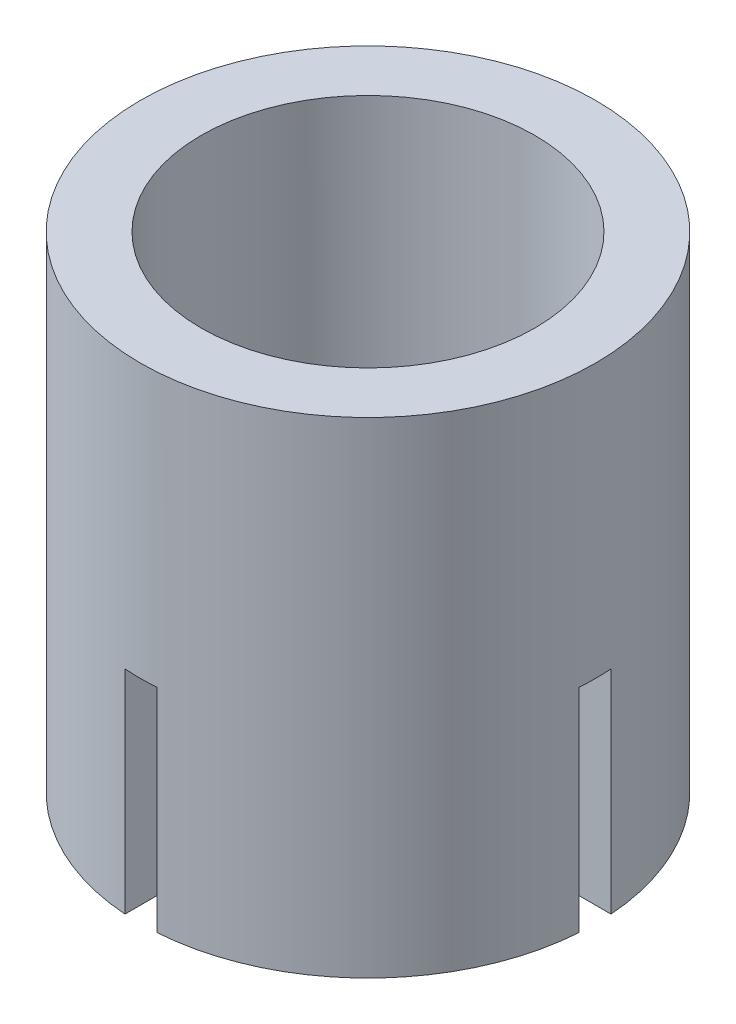
ISO-10303-21;
HEADER;
FILE_DESCRIPTION(('STEP AP214'),'2;1');
FILE_NAME('part.step','',(''),(''),'','','');
FILE_SCHEMA(('AUTOMOTIVE_DESIGN { 1 0 10303 214 1 1 1 1 }'));
ENDSEC;
DATA;
#1=APPLICATION_CONTEXT('core data for automotive mechanical design processes');
#2=APPLICATION_PROTOCOL_DEFINITION('international standard','automotive_design',2000,#1);
#3=PRODUCT_CONTEXT('',#1,'mechanical');
#4=PRODUCT('Part','Part','',(#3));
#5=PRODUCT_RELATED_PRODUCT_CATEGORY('part','',(#4));
#6=PRODUCT_DEFINITION_FORMATION('','',#4);
#7=PRODUCT_DEFINITION_CONTEXT('part definition',#1,'design');
#8=PRODUCT_DEFINITION('design','',#6,#7);
#9=PRODUCT_DEFINITION_SHAPE('','',#8);
#10=(LENGTH_UNIT() NAMED_UNIT(*) SI_UNIT(.MILLI.,.METRE.));
#11=(NAMED_UNIT(*) PLANE_ANGLE_UNIT() SI_UNIT($,.RADIAN.));
#12=(NAMED_UNIT(*) SI_UNIT($,.STERADIAN.) SOLID_ANGLE_UNIT());
#13=UNCERTAINTY_MEASURE_WITH_UNIT(LENGTH_MEASURE(1.E-05),#10,'distance_accuracy_value','');
#14=(GEOMETRIC_REPRESENTATION_CONTEXT(3) GLOBAL_UNCERTAINTY_ASSIGNED_CONTEXT((#13)) GLOBAL_UNIT_ASSIGNED_CONTEXT((#10,
#11,#12)) REPRESENTATION_CONTEXT('',''));
#15=CARTESIAN_POINT('',(0.,0.,0.));
#16=DIRECTION('',(0.,0.,1.));
#17=DIRECTION('',(1.,0.,0.));
#18=AXIS2_PLACEMENT_3D('',#15,#16,#17);
#19=CARTESIAN_POINT('',(0.,6.,0.));
#20=DIRECTION('',(0.,1.,0.));
#21=DIRECTION('',(0.,0.,1.));
#22=AXIS2_PLACEMENT_3D('',#19,#20,#21);
#23=PLANE('',#22);
#24=CARTESIAN_POINT('',(0.,6.,0.));
#25=DIRECTION('',(0.,1.,0.));
#26=DIRECTION('',(0.,0.,1.));
#27=AXIS2_PLACEMENT_3D('',#24,#25,#26);
#28=CIRCLE('',#27,3.);
#29=CARTESIAN_POINT('',(0.527362107006941,6.,2.9532844780165));
#30=VERTEX_POINT('',#29);
#31=CARTESIAN_POINT('',(2.9532844780165,6.,0.527362107006941));
#32=VERTEX_POINT('',#31);
#33=EDGE_CURVE('E252',#30,#32,#28,.T.);
#34=ORIENTED_EDGE('',*,*,#33,.F.);
#35=DIRECTION('',(0.,0.,1.));
#36=VECTOR('',#35,1.);
#37=CARTESIAN_POINT('',(0.527362107006941,6.,0.));
#38=LINE('',#37,#36);
#39=CARTESIAN_POINT('',(0.527362107006941,6.,5.47465882115892));
#40=VERTEX_POINT('',#39);
#41=EDGE_CURVE('E344',#30,#40,#38,.T.);
#42=ORIENTED_EDGE('',*,*,#41,.T.);
#43=CARTESIAN_POINT('',(0.,6.,0.));
#44=DIRECTION('',(0.,1.,0.));
#45=DIRECTION('',(0.,0.,1.));
#46=AXIS2_PLACEMENT_3D('',#43,#44,#45);
#47=CIRCLE('',#46,5.5);
#48=CARTESIAN_POINT('',(5.47465882115892,6.,0.527362107006941));
#49=VERTEX_POINT('',#48);
#50=EDGE_CURVE('E355',#40,#49,#47,.T.);
#51=ORIENTED_EDGE('',*,*,#50,.T.);
#52=DIRECTION('',(-1.,0.,0.));
#53=VECTOR('',#52,1.);
#54=CARTESIAN_POINT('',(0.,6.,0.527362107006941));
#55=LINE('',#54,#53);
#56=EDGE_CURVE('E332',#49,#32,#55,.T.);
#57=ORIENTED_EDGE('',*,*,#56,.T.);
#58=EDGE_LOOP('',(#34,#42,#51,#57));
#59=FACE_BOUND('',#58,.T.);
#60=ADVANCED_FACE('F39',(#59),#23,.T.);
#61=DIRECTION('',(0.,0.,1.));
#62=VECTOR('',#61,1.);
#63=CARTESIAN_POINT('',(-0.527362107006938,6.,0.));
#64=LINE('',#63,#62);
#65=CARTESIAN_POINT('',(-0.527362107006938,6.,2.9532844780165));
#66=VERTEX_POINT('',#65);
#67=CARTESIAN_POINT('',(-0.527362107006938,6.,5.47465882115892));
#68=VERTEX_POINT('',#67);
#69=EDGE_CURVE('E339',#66,#68,#64,.T.);
#70=ORIENTED_EDGE('',*,*,#69,.F.);
#71=CARTESIAN_POINT('',(-2.9532844780165,6.,0.527362107006941));
#72=VERTEX_POINT('',#71);
#73=EDGE_CURVE('E222',#72,#66,#28,.T.);
#74=ORIENTED_EDGE('',*,*,#73,.F.);
#75=DIRECTION('',(-1.,0.,0.));
#76=VECTOR('',#75,1.);
#77=CARTESIAN_POINT('',(0.,6.,0.527362107006941));
#78=LINE('',#77,#76);
#79=CARTESIAN_POINT('',(-5.47465882115892,6.,0.527362107006941));
#80=VERTEX_POINT('',#79);
#81=EDGE_CURVE('E316',#72,#80,#78,.T.);
#82=ORIENTED_EDGE('',*,*,#81,.T.);
#83=EDGE_CURVE('E351',#80,#68,#47,.T.);
#84=ORIENTED_EDGE('',*,*,#83,.T.);
#85=EDGE_LOOP('',(#70,#74,#82,#84));
#86=FACE_BOUND('',#85,.T.);
#87=ADVANCED_FACE('F534',(#86),#23,.T.);
#88=DIRECTION('',(-1.,0.,0.));
#89=VECTOR('',#88,1.);
#90=CARTESIAN_POINT('',(0.,6.,-0.527362107006941));
#91=LINE('',#90,#89);
#92=CARTESIAN_POINT('',(5.47465882115892,6.,-0.527362107006941));
#93=VERTEX_POINT('',#92);
#94=CARTESIAN_POINT('',(2.9532844780165,6.,-0.527362107006941));
#95=VERTEX_POINT('',#94);
#96=EDGE_CURVE('E329',#93,#95,#91,.T.);
#97=ORIENTED_EDGE('',*,*,#96,.F.);
#98=CARTESIAN_POINT('',(0.527362107006941,6.,-5.47465882115892));
#99=VERTEX_POINT('',#98);
#100=EDGE_CURVE('E358',#93,#99,#47,.T.);
#101=ORIENTED_EDGE('',*,*,#100,.T.);
#102=DIRECTION('',(0.,0.,1.));
#103=VECTOR('',#102,1.);
#104=CARTESIAN_POINT('',(0.527362107006941,6.,0.));
#105=LINE('',#104,#103);
#106=CARTESIAN_POINT('',(0.527362107006941,6.,-2.9532844780165));
#107=VERTEX_POINT('',#106);
#108=EDGE_CURVE('E326',#99,#107,#105,.T.);
#109=ORIENTED_EDGE('',*,*,#108,.T.);
#110=EDGE_CURVE('E271',#95,#107,#28,.T.);
#111=ORIENTED_EDGE('',*,*,#110,.F.);
#112=EDGE_LOOP('',(#97,#101,#109,#111));
#113=FACE_BOUND('',#112,.T.);
#114=ADVANCED_FACE('F529',(#113),#23,.T.);
#115=DIRECTION('',(0.,0.,1.));
#116=VECTOR('',#115,1.);
#117=CARTESIAN_POINT('',(-0.527362107006938,6.,0.));
#118=LINE('',#117,#116);
#119=CARTESIAN_POINT('',(-0.527362107006938,6.,-5.47465882115892));
#120=VERTEX_POINT('',#119);
#121=CARTESIAN_POINT('',(-0.527362107006938,6.,-2.9532844780165));
#122=VERTEX_POINT('',#121);
#123=EDGE_CURVE('E323',#120,#122,#118,.T.);
#124=ORIENTED_EDGE('',*,*,#123,.F.);
#125=CARTESIAN_POINT('',(-5.47465882115892,6.,-0.527362107006941));
#126=VERTEX_POINT('',#125);
#127=EDGE_CURVE('E383',#120,#126,#47,.T.);
#128=ORIENTED_EDGE('',*,*,#127,.T.);
#129=DIRECTION('',(-1.,0.,0.));
#130=VECTOR('',#129,1.);
#131=CARTESIAN_POINT('',(0.,6.,-0.527362107006941));
#132=LINE('',#131,#130);
#133=CARTESIAN_POINT('',(-2.9532844780165,6.,-0.527362107006941));
#134=VERTEX_POINT('',#133);
#135=EDGE_CURVE('E309',#134,#126,#132,.T.);
#136=ORIENTED_EDGE('',*,*,#135,.F.);
#137=EDGE_CURVE('E251',#122,#134,#28,.T.);
#138=ORIENTED_EDGE('',*,*,#137,.F.);
#139=EDGE_LOOP('',(#124,#128,#136,#138));
#140=FACE_BOUND('',#139,.T.);
#141=ADVANCED_FACE('F380',(#140),#23,.T.);
#142=CARTESIAN_POINT('',(0.,0.,0.));
#143=DIRECTION('',(0.,1.,0.));
#144=DIRECTION('',(0.,0.,1.));
#145=AXIS2_PLACEMENT_3D('',#142,#143,#144);
#146=PLANE('',#145);
#147=DIRECTION('',(0.,0.,-1.));
#148=VECTOR('',#147,1.);
#149=CARTESIAN_POINT('',(0.527362107006941,0.,0.));
#150=LINE('',#149,#148);
#151=CARTESIAN_POINT('',(0.527362107006941,0.,7.48143630649177));
#152=VERTEX_POINT('',#151);
#153=CARTESIAN_POINT('',(0.527362107006941,0.,2.9532844780165));
#154=VERTEX_POINT('',#153);
#155=EDGE_CURVE('E213',#152,#154,#150,.T.);
#156=ORIENTED_EDGE('',*,*,#155,.T.);
#157=CARTESIAN_POINT('',(0.,0.,0.));
#158=DIRECTION('',(0.,1.,0.));
#159=DIRECTION('',(0.,0.,1.));
#160=AXIS2_PLACEMENT_3D('',#157,#158,#159);
#161=CIRCLE('',#160,3.);
#162=CARTESIAN_POINT('',(2.9532844780165,0.,0.527362107006941));
#163=VERTEX_POINT('',#162);
#164=EDGE_CURVE('E233',#154,#163,#161,.T.);
#165=ORIENTED_EDGE('',*,*,#164,.T.);
#166=DIRECTION('',(1.,0.,0.));
#167=VECTOR('',#166,1.);
#168=CARTESIAN_POINT('',(0.,0.,0.527362107006941));
#169=LINE('',#168,#167);
#170=CARTESIAN_POINT('',(7.48143630649177,0.,0.527362107006941));
#171=VERTEX_POINT('',#170);
#172=EDGE_CURVE('E455',#163,#171,#169,.T.);
#173=ORIENTED_EDGE('',*,*,#172,.T.);
#174=CARTESIAN_POINT('',(0.,0.,0.));
#175=DIRECTION('',(0.,1.,0.));
#176=DIRECTION('',(0.,0.,1.));
#177=AXIS2_PLACEMENT_3D('',#174,#175,#176);
#178=CIRCLE('',#177,7.5);
#179=EDGE_CURVE('E369',#152,#171,#178,.T.);
#180=ORIENTED_EDGE('',*,*,#179,.F.);
#181=EDGE_LOOP('',(#156,#165,#173,#180));
#182=FACE_BOUND('',#181,.T.);
#183=ADVANCED_FACE('F509',(#182),#146,.F.);
#184=CARTESIAN_POINT('',(-2.9532844780165,0.,0.527362107006941));
#185=VERTEX_POINT('',#184);
#186=CARTESIAN_POINT('',(-0.527362107006938,0.,2.9532844780165));
#187=VERTEX_POINT('',#186);
#188=EDGE_CURVE('E220',#185,#187,#161,.T.);
#189=ORIENTED_EDGE('',*,*,#188,.T.);
#190=DIRECTION('',(0.,0.,-1.));
#191=VECTOR('',#190,1.);
#192=CARTESIAN_POINT('',(-0.527362107006938,0.,0.));
#193=LINE('',#192,#191);
#194=CARTESIAN_POINT('',(-0.527362107006938,0.,7.48143630649177));
#195=VERTEX_POINT('',#194);
#196=EDGE_CURVE('E200',#195,#187,#193,.T.);
#197=ORIENTED_EDGE('',*,*,#196,.F.);
#198=CARTESIAN_POINT('',(-7.48143630649177,0.,0.527362107006941));
#199=VERTEX_POINT('',#198);
#200=EDGE_CURVE('E361',#199,#195,#178,.T.);
#201=ORIENTED_EDGE('',*,*,#200,.F.);
#202=DIRECTION('',(1.,0.,0.));
#203=VECTOR('',#202,1.);
#204=CARTESIAN_POINT('',(0.,0.,0.527362107006941));
#205=LINE('',#204,#203);
#206=EDGE_CURVE('E228',#199,#185,#205,.T.);
#207=ORIENTED_EDGE('',*,*,#206,.T.);
#208=EDGE_LOOP('',(#189,#197,#201,#207));
#209=FACE_BOUND('',#208,.T.);
#210=ADVANCED_FACE('F227',(#209),#146,.F.);
#211=CARTESIAN_POINT('',(7.48143630649177,0.,-0.527362107006941));
#212=VERTEX_POINT('',#211);
#213=CARTESIAN_POINT('',(0.527362107006941,0.,-7.48143630649177));
#214=VERTEX_POINT('',#213);
#215=EDGE_CURVE('E502',#212,#214,#178,.T.);
#216=ORIENTED_EDGE('',*,*,#215,.F.);
#217=DIRECTION('',(1.,0.,0.));
#218=VECTOR('',#217,1.);
#219=CARTESIAN_POINT('',(0.,0.,-0.527362107006941));
#220=LINE('',#219,#218);
#221=CARTESIAN_POINT('',(2.9532844780165,0.,-0.527362107006941));
#222=VERTEX_POINT('',#221);
#223=EDGE_CURVE('E262',#222,#212,#220,.T.);
#224=ORIENTED_EDGE('',*,*,#223,.F.);
#225=CARTESIAN_POINT('',(0.527362107006941,0.,-2.9532844780165));
#226=VERTEX_POINT('',#225);
#227=EDGE_CURVE('E237',#222,#226,#161,.T.);
#228=ORIENTED_EDGE('',*,*,#227,.T.);
#229=DIRECTION('',(0.,0.,-1.));
#230=VECTOR('',#229,1.);
#231=CARTESIAN_POINT('',(0.527362107006941,0.,0.));
#232=LINE('',#231,#230);
#233=EDGE_CURVE('E260',#226,#214,#232,.T.);
#234=ORIENTED_EDGE('',*,*,#233,.T.);
#235=EDGE_LOOP('',(#216,#224,#228,#234));
#236=FACE_BOUND('',#235,.T.);
#237=ADVANCED_FACE('F259',(#236),#146,.F.);
#238=CARTESIAN_POINT('',(-0.527362107006938,0.,-7.48143630649177));
#239=VERTEX_POINT('',#238);
#240=CARTESIAN_POINT('',(-7.48143630649177,0.,-0.527362107006941));
#241=VERTEX_POINT('',#240);
#242=EDGE_CURVE('E368',#239,#241,#178,.T.);
#243=ORIENTED_EDGE('',*,*,#242,.F.);
#244=DIRECTION('',(0.,0.,-1.));
#245=VECTOR('',#244,1.);
#246=CARTESIAN_POINT('',(-0.527362107006938,0.,0.));
#247=LINE('',#246,#245);
#248=CARTESIAN_POINT('',(-0.527362107006938,0.,-2.9532844780165));
#249=VERTEX_POINT('',#248);
#250=EDGE_CURVE('E479',#249,#239,#247,.T.);
#251=ORIENTED_EDGE('',*,*,#250,.F.);
#252=CARTESIAN_POINT('',(-2.9532844780165,0.,-0.527362107006941));
#253=VERTEX_POINT('',#252);
#254=EDGE_CURVE('E230',#249,#253,#161,.T.);
#255=ORIENTED_EDGE('',*,*,#254,.T.);
#256=DIRECTION('',(1.,0.,0.));
#257=VECTOR('',#256,1.);
#258=CARTESIAN_POINT('',(0.,0.,-0.527362107006941));
#259=LINE('',#258,#257);
#260=EDGE_CURVE('E295',#241,#253,#259,.T.);
#261=ORIENTED_EDGE('',*,*,#260,.F.);
#262=EDGE_LOOP('',(#243,#251,#255,#261));
#263=FACE_BOUND('',#262,.T.);
#264=ADVANCED_FACE('F500',(#263),#146,.F.);
#265=CARTESIAN_POINT('',(0.,6.,0.));
#266=DIRECTION('',(0.,-1.,0.));
#267=DIRECTION('',(0.,0.,-1.));
#268=AXIS2_PLACEMENT_3D('',#265,#266,#267);
#269=CYLINDRICAL_SURFACE('',#268,7.5);
#270=CARTESIAN_POINT('',(0.,16.,0.));
#271=DIRECTION('',(0.,1.,0.));
#272=DIRECTION('',(0.,0.,1.));
#273=AXIS2_PLACEMENT_3D('',#270,#271,#272);
#274=CIRCLE('',#273,7.5);
#275=CARTESIAN_POINT('',(0.,16.,7.5));
#276=VERTEX_POINT('',#275);
#277=EDGE_CURVE('E231',#276,#276,#274,.T.);
#278=ORIENTED_EDGE('',*,*,#277,.F.);
#279=EDGE_LOOP('',(#278));
#280=FACE_BOUND('',#279,.T.);
#281=DIRECTION('',(0.,-1.,0.));
#282=VECTOR('',#281,1.);
#283=CARTESIAN_POINT('',(0.527362107006941,6.,7.48143630649177));
#284=LINE('',#283,#282);
#285=CARTESIAN_POINT('',(0.527362107006941,7.,7.48143630649177));
#286=VERTEX_POINT('',#285);
#287=EDGE_CURVE('E348',#152,#286,#284,.F.);
#288=ORIENTED_EDGE('',*,*,#287,.F.);
#289=ORIENTED_EDGE('',*,*,#179,.T.);
#290=DIRECTION('',(0.,-1.,0.));
#291=VECTOR('',#290,1.);
#292=CARTESIAN_POINT('',(7.48143630649177,7.,0.527362107006941));
#293=LINE('',#292,#291);
#294=CARTESIAN_POINT('',(7.48143630649177,7.,0.527362107006941));
#295=VERTEX_POINT('',#294);
#296=EDGE_CURVE('E467',#295,#171,#293,.T.);
#297=ORIENTED_EDGE('',*,*,#296,.F.);
#298=CARTESIAN_POINT('',(0.,7.,0.));
#299=DIRECTION('',(0.,-1.,0.));
#300=DIRECTION('',(0.,0.,-1.));
#301=AXIS2_PLACEMENT_3D('',#298,#299,#300);
#302=CIRCLE('',#301,7.5);
#303=CARTESIAN_POINT('',(7.48143630649177,7.,-0.527362107006941));
#304=VERTEX_POINT('',#303);
#305=EDGE_CURVE('E454',#304,#295,#302,.T.);
#306=ORIENTED_EDGE('',*,*,#305,.F.);
#307=DIRECTION('',(0.,-1.,0.));
#308=VECTOR('',#307,1.);
#309=CARTESIAN_POINT('',(7.48143630649177,7.,-0.527362107006941));
#310=LINE('',#309,#308);
#311=EDGE_CURVE('E470',#304,#212,#310,.T.);
#312=ORIENTED_EDGE('',*,*,#311,.T.);
#313=ORIENTED_EDGE('',*,*,#215,.T.);
#314=DIRECTION('',(0.,-1.,0.));
#315=VECTOR('',#314,1.);
#316=CARTESIAN_POINT('',(0.527362107006941,7.,-7.48143630649177));
#317=LINE('',#316,#315);
#318=CARTESIAN_POINT('',(0.527362107006941,7.,-7.48143630649177));
#319=VERTEX_POINT('',#318);
#320=EDGE_CURVE('E462',#319,#214,#317,.T.);
#321=ORIENTED_EDGE('',*,*,#320,.F.);
#322=CARTESIAN_POINT('',(0.,7.,0.));
#323=DIRECTION('',(0.,-1.,0.));
#324=DIRECTION('',(0.,0.,-1.));
#325=AXIS2_PLACEMENT_3D('',#322,#323,#324);
#326=CIRCLE('',#325,7.5);
#327=CARTESIAN_POINT('',(-0.527362107006938,7.,-7.48143630649177));
#328=VERTEX_POINT('',#327);
#329=EDGE_CURVE('E276',#328,#319,#326,.T.);
#330=ORIENTED_EDGE('',*,*,#329,.F.);
#331=DIRECTION('',(0.,-1.,0.));
#332=VECTOR('',#331,1.);
#333=CARTESIAN_POINT('',(-0.527362107006938,7.,-7.48143630649177));
#334=LINE('',#333,#332);
#335=EDGE_CURVE('E280',#328,#239,#334,.T.);
#336=ORIENTED_EDGE('',*,*,#335,.T.);
#337=ORIENTED_EDGE('',*,*,#242,.T.);
#338=DIRECTION('',(0.,-1.,0.));
#339=VECTOR('',#338,1.);
#340=CARTESIAN_POINT('',(-7.48143630649177,6.,-0.527362107006941));
#341=LINE('',#340,#339);
#342=CARTESIAN_POINT('',(-7.48143630649177,7.,-0.527362107006941));
#343=VERTEX_POINT('',#342);
#344=EDGE_CURVE('E312',#241,#343,#341,.F.);
#345=ORIENTED_EDGE('',*,*,#344,.T.);
#346=CARTESIAN_POINT('',(0.,7.,0.));
#347=DIRECTION('',(0.,-1.,0.));
#348=DIRECTION('',(0.,0.,-1.));
#349=AXIS2_PLACEMENT_3D('',#346,#347,#348);
#350=CIRCLE('',#349,7.5);
#351=CARTESIAN_POINT('',(-7.48143630649177,7.,0.527362107006941));
#352=VERTEX_POINT('',#351);
#353=EDGE_CURVE('E306',#352,#343,#350,.T.);
#354=ORIENTED_EDGE('',*,*,#353,.F.);
#355=DIRECTION('',(0.,-1.,0.));
#356=VECTOR('',#355,1.);
#357=CARTESIAN_POINT('',(-7.48143630649177,6.,0.527362107006941));
#358=LINE('',#357,#356);
#359=EDGE_CURVE('E320',#199,#352,#358,.F.);
#360=ORIENTED_EDGE('',*,*,#359,.F.);
#361=ORIENTED_EDGE('',*,*,#200,.T.);
#362=DIRECTION('',(0.,-1.,0.));
#363=VECTOR('',#362,1.);
#364=CARTESIAN_POINT('',(-0.527362107006938,6.,7.48143630649177));
#365=LINE('',#364,#363);
#366=CARTESIAN_POINT('',(-0.527362107006938,7.,7.48143630649177));
#367=VERTEX_POINT('',#366);
#368=EDGE_CURVE('E206',#195,#367,#365,.F.);
#369=ORIENTED_EDGE('',*,*,#368,.T.);
#370=CARTESIAN_POINT('',(0.,7.,0.));
#371=DIRECTION('',(0.,-1.,0.));
#372=DIRECTION('',(0.,0.,-1.));
#373=AXIS2_PLACEMENT_3D('',#370,#371,#372);
#374=CIRCLE('',#373,7.5);
#375=EDGE_CURVE('E336',#286,#367,#374,.T.);
#376=ORIENTED_EDGE('',*,*,#375,.F.);
#377=EDGE_LOOP('',(#288,#289,#297,#306,#312,#313,#321,#330,#336,#337,#345,#354,#360,#361,#369,#376));
#378=FACE_BOUND('',#377,.T.);
#379=ADVANCED_FACE('F41',(#280,#378),#269,.T.);
#380=CARTESIAN_POINT('',(0.,6.,0.));
#381=DIRECTION('',(0.,-1.,0.));
#382=DIRECTION('',(0.,0.,-1.));
#383=AXIS2_PLACEMENT_3D('',#380,#381,#382);
#384=CYLINDRICAL_SURFACE('',#383,3.);
#385=ORIENTED_EDGE('',*,*,#164,.F.);
#386=DIRECTION('',(0.,-1.,0.));
#387=VECTOR('',#386,1.);
#388=CARTESIAN_POINT('',(0.527362107006941,7.,2.9532844780165));
#389=LINE('',#388,#387);
#390=EDGE_CURVE('E224',#30,#154,#389,.T.);
#391=ORIENTED_EDGE('',*,*,#390,.F.);
#392=ORIENTED_EDGE('',*,*,#33,.T.);
#393=DIRECTION('',(0.,-1.,0.));
#394=VECTOR('',#393,1.);
#395=CARTESIAN_POINT('',(2.9532844780165,7.,0.527362107006941));
#396=LINE('',#395,#394);
#397=EDGE_CURVE('E447',#32,#163,#396,.T.);
#398=ORIENTED_EDGE('',*,*,#397,.T.);
#399=EDGE_LOOP('',(#385,#391,#392,#398));
#400=FACE_BOUND('',#399,.T.);
#401=ADVANCED_FACE('F512',(#400),#384,.F.);
#402=DIRECTION('',(0.,-1.,0.));
#403=VECTOR('',#402,1.);
#404=CARTESIAN_POINT('',(-0.527362107006938,7.,2.9532844780165));
#405=LINE('',#404,#403);
#406=EDGE_CURVE('E203',#66,#187,#405,.T.);
#407=ORIENTED_EDGE('',*,*,#406,.T.);
#408=ORIENTED_EDGE('',*,*,#188,.F.);
#409=DIRECTION('',(0.,-1.,0.));
#410=VECTOR('',#409,1.);
#411=CARTESIAN_POINT('',(-2.9532844780165,7.,0.527362107006941));
#412=LINE('',#411,#410);
#413=EDGE_CURVE('E300',#72,#185,#412,.T.);
#414=ORIENTED_EDGE('',*,*,#413,.F.);
#415=ORIENTED_EDGE('',*,*,#73,.T.);
#416=EDGE_LOOP('',(#407,#408,#414,#415));
#417=FACE_BOUND('',#416,.T.);
#418=ADVANCED_FACE('F218',(#417),#384,.F.);
#419=DIRECTION('',(0.,-1.,0.));
#420=VECTOR('',#419,1.);
#421=CARTESIAN_POINT('',(2.9532844780165,7.,-0.527362107006941));
#422=LINE('',#421,#420);
#423=EDGE_CURVE('E268',#95,#222,#422,.T.);
#424=ORIENTED_EDGE('',*,*,#423,.F.);
#425=ORIENTED_EDGE('',*,*,#110,.T.);
#426=DIRECTION('',(0.,-1.,0.));
#427=VECTOR('',#426,1.);
#428=CARTESIAN_POINT('',(0.527362107006941,7.,-2.9532844780165));
#429=LINE('',#428,#427);
#430=EDGE_CURVE('E270',#107,#226,#429,.T.);
#431=ORIENTED_EDGE('',*,*,#430,.T.);
#432=ORIENTED_EDGE('',*,*,#227,.F.);
#433=EDGE_LOOP('',(#424,#425,#431,#432));
#434=FACE_BOUND('',#433,.T.);
#435=ADVANCED_FACE('F266',(#434),#384,.F.);
#436=DIRECTION('',(0.,-1.,0.));
#437=VECTOR('',#436,1.);
#438=CARTESIAN_POINT('',(-0.527362107006938,7.,-2.9532844780165));
#439=LINE('',#438,#437);
#440=EDGE_CURVE('E275',#122,#249,#439,.T.);
#441=ORIENTED_EDGE('',*,*,#440,.F.);
#442=ORIENTED_EDGE('',*,*,#137,.T.);
#443=DIRECTION('',(0.,-1.,0.));
#444=VECTOR('',#443,1.);
#445=CARTESIAN_POINT('',(-2.9532844780165,7.,-0.527362107006941));
#446=LINE('',#445,#444);
#447=EDGE_CURVE('E294',#134,#253,#446,.T.);
#448=ORIENTED_EDGE('',*,*,#447,.T.);
#449=ORIENTED_EDGE('',*,*,#254,.F.);
#450=EDGE_LOOP('',(#441,#442,#448,#449));
#451=FACE_BOUND('',#450,.T.);
#452=ADVANCED_FACE('F375',(#451),#384,.F.);
#453=CARTESIAN_POINT('',(0.,16.,0.));
#454=DIRECTION('',(0.,-1.,0.));
#455=DIRECTION('',(0.,0.,-1.));
#456=AXIS2_PLACEMENT_3D('',#453,#454,#455);
#457=CYLINDRICAL_SURFACE('',#456,5.5);
#458=CARTESIAN_POINT('',(0.,16.,0.));
#459=DIRECTION('',(0.,1.,0.));
#460=DIRECTION('',(0.,0.,1.));
#461=AXIS2_PLACEMENT_3D('',#458,#459,#460);
#462=CIRCLE('',#461,5.5);
#463=CARTESIAN_POINT('',(0.,16.,5.5));
#464=VERTEX_POINT('',#463);
#465=EDGE_CURVE('E239',#464,#464,#462,.T.);
#466=ORIENTED_EDGE('',*,*,#465,.T.);
#467=EDGE_LOOP('',(#466));
#468=FACE_BOUND('',#467,.T.);
#469=ORIENTED_EDGE('',*,*,#50,.F.);
#470=DIRECTION('',(0.,-1.,0.));
#471=VECTOR('',#470,1.);
#472=CARTESIAN_POINT('',(0.527362107006941,16.,5.47465882115892));
#473=LINE('',#472,#471);
#474=CARTESIAN_POINT('',(0.527362107006941,7.,5.47465882115892));
#475=VERTEX_POINT('',#474);
#476=EDGE_CURVE('E11',#40,#475,#473,.F.);
#477=ORIENTED_EDGE('',*,*,#476,.T.);
#478=CARTESIAN_POINT('',(0.,7.,0.));
#479=DIRECTION('',(0.,-1.,0.));
#480=DIRECTION('',(0.,0.,-1.));
#481=AXIS2_PLACEMENT_3D('',#478,#479,#480);
#482=CIRCLE('',#481,5.5);
#483=CARTESIAN_POINT('',(-0.527362107006938,7.,5.47465882115892));
#484=VERTEX_POINT('',#483);
#485=EDGE_CURVE('E427',#475,#484,#482,.T.);
#486=ORIENTED_EDGE('',*,*,#485,.T.);
#487=DIRECTION('',(0.,-1.,0.));
#488=VECTOR('',#487,1.);
#489=CARTESIAN_POINT('',(-0.527362107006938,16.,5.47465882115892));
#490=LINE('',#489,#488);
#491=EDGE_CURVE('E48',#68,#484,#490,.F.);
#492=ORIENTED_EDGE('',*,*,#491,.F.);
#493=ORIENTED_EDGE('',*,*,#83,.F.);
#494=DIRECTION('',(0.,-1.,0.));
#495=VECTOR('',#494,1.);
#496=CARTESIAN_POINT('',(-5.47465882115892,16.,0.527362107006941));
#497=LINE('',#496,#495);
#498=CARTESIAN_POINT('',(-5.47465882115892,7.,0.527362107006941));
#499=VERTEX_POINT('',#498);
#500=EDGE_CURVE('E398',#80,#499,#497,.F.);
#501=ORIENTED_EDGE('',*,*,#500,.T.);
#502=CARTESIAN_POINT('',(0.,7.,0.));
#503=DIRECTION('',(0.,-1.,0.));
#504=DIRECTION('',(0.,0.,-1.));
#505=AXIS2_PLACEMENT_3D('',#502,#503,#504);
#506=CIRCLE('',#505,5.5);
#507=CARTESIAN_POINT('',(-5.47465882115892,7.,-0.527362107006941));
#508=VERTEX_POINT('',#507);
#509=EDGE_CURVE('E396',#499,#508,#506,.T.);
#510=ORIENTED_EDGE('',*,*,#509,.T.);
#511=DIRECTION('',(0.,-1.,0.));
#512=VECTOR('',#511,1.);
#513=CARTESIAN_POINT('',(-5.47465882115892,16.,-0.527362107006941));
#514=LINE('',#513,#512);
#515=EDGE_CURVE('E389',#126,#508,#514,.F.);
#516=ORIENTED_EDGE('',*,*,#515,.F.);
#517=ORIENTED_EDGE('',*,*,#127,.F.);
#518=DIRECTION('',(0.,-1.,0.));
#519=VECTOR('',#518,1.);
#520=CARTESIAN_POINT('',(-0.527362107006938,16.,-5.47465882115892));
#521=LINE('',#520,#519);
#522=CARTESIAN_POINT('',(-0.527362107006938,7.,-5.47465882115892));
#523=VERTEX_POINT('',#522);
#524=EDGE_CURVE('E409',#523,#120,#521,.T.);
#525=ORIENTED_EDGE('',*,*,#524,.F.);
#526=CARTESIAN_POINT('',(0.,7.,0.));
#527=DIRECTION('',(0.,-1.,0.));
#528=DIRECTION('',(0.,0.,-1.));
#529=AXIS2_PLACEMENT_3D('',#526,#527,#528);
#530=CIRCLE('',#529,5.5);
#531=CARTESIAN_POINT('',(0.527362107006941,7.,-5.47465882115892));
#532=VERTEX_POINT('',#531);
#533=EDGE_CURVE('E402',#523,#532,#530,.T.);
#534=ORIENTED_EDGE('',*,*,#533,.T.);
#535=DIRECTION('',(0.,-1.,0.));
#536=VECTOR('',#535,1.);
#537=CARTESIAN_POINT('',(0.527362107006941,16.,-5.47465882115892));
#538=LINE('',#537,#536);
#539=EDGE_CURVE('E412',#532,#99,#538,.T.);
#540=ORIENTED_EDGE('',*,*,#539,.T.);
#541=ORIENTED_EDGE('',*,*,#100,.F.);
#542=DIRECTION('',(0.,-1.,0.));
#543=VECTOR('',#542,1.);
#544=CARTESIAN_POINT('',(5.47465882115892,16.,-0.527362107006941));
#545=LINE('',#544,#543);
#546=CARTESIAN_POINT('',(5.47465882115892,7.,-0.527362107006941));
#547=VERTEX_POINT('',#546);
#548=EDGE_CURVE('E420',#547,#93,#545,.T.);
#549=ORIENTED_EDGE('',*,*,#548,.F.);
#550=CARTESIAN_POINT('',(0.,7.,0.));
#551=DIRECTION('',(0.,-1.,0.));
#552=DIRECTION('',(0.,0.,-1.));
#553=AXIS2_PLACEMENT_3D('',#550,#551,#552);
#554=CIRCLE('',#553,5.5);
#555=CARTESIAN_POINT('',(5.47465882115892,7.,0.527362107006941));
#556=VERTEX_POINT('',#555);
#557=EDGE_CURVE('E416',#547,#556,#554,.T.);
#558=ORIENTED_EDGE('',*,*,#557,.T.);
#559=DIRECTION('',(0.,-1.,0.));
#560=VECTOR('',#559,1.);
#561=CARTESIAN_POINT('',(5.47465882115892,16.,0.527362107006941));
#562=LINE('',#561,#560);
#563=EDGE_CURVE('E423',#556,#49,#562,.T.);
#564=ORIENTED_EDGE('',*,*,#563,.T.);
#565=EDGE_LOOP('',(#469,#477,#486,#492,#493,#501,#510,#516,#517,#525,#534,#540,#541,#549,#558,#564));
#566=FACE_BOUND('',#565,.T.);
#567=ADVANCED_FACE('F393',(#468,#566),#457,.F.);
#568=CARTESIAN_POINT('',(0.,16.,0.));
#569=DIRECTION('',(0.,1.,0.));
#570=DIRECTION('',(0.,0.,1.));
#571=AXIS2_PLACEMENT_3D('',#568,#569,#570);
#572=PLANE('',#571);
#573=ORIENTED_EDGE('',*,*,#277,.T.);
#574=EDGE_LOOP('',(#573));
#575=FACE_BOUND('',#574,.T.);
#576=ORIENTED_EDGE('',*,*,#465,.F.);
#577=EDGE_LOOP('',(#576));
#578=FACE_BOUND('',#577,.T.);
#579=ADVANCED_FACE('F578',(#575,#578),#572,.T.);
#580=CARTESIAN_POINT('',(0.,7.,0.527362107006941));
#581=DIRECTION('',(0.,0.,-1.));
#582=DIRECTION('',(-1.,0.,0.));
#583=AXIS2_PLACEMENT_3D('',#580,#581,#582);
#584=PLANE('',#583);
#585=ORIENTED_EDGE('',*,*,#359,.T.);
#586=DIRECTION('',(1.,0.,0.));
#587=VECTOR('',#586,1.);
#588=CARTESIAN_POINT('',(0.,7.,0.527362107006941));
#589=LINE('',#588,#587);
#590=EDGE_CURVE('E290',#352,#499,#589,.T.);
#591=ORIENTED_EDGE('',*,*,#590,.T.);
#592=ORIENTED_EDGE('',*,*,#500,.F.);
#593=ORIENTED_EDGE('',*,*,#81,.F.);
#594=ORIENTED_EDGE('',*,*,#413,.T.);
#595=ORIENTED_EDGE('',*,*,#206,.F.);
#596=EDGE_LOOP('',(#585,#591,#592,#593,#594,#595));
#597=FACE_BOUND('',#596,.T.);
#598=ADVANCED_FACE('F536',(#597),#584,.T.);
#599=CARTESIAN_POINT('',(0.,7.,-0.527362107006941));
#600=DIRECTION('',(0.,0.,-1.));
#601=DIRECTION('',(-1.,0.,0.));
#602=AXIS2_PLACEMENT_3D('',#599,#600,#601);
#603=PLANE('',#602);
#604=ORIENTED_EDGE('',*,*,#260,.T.);
#605=ORIENTED_EDGE('',*,*,#447,.F.);
#606=ORIENTED_EDGE('',*,*,#135,.T.);
#607=ORIENTED_EDGE('',*,*,#515,.T.);
#608=DIRECTION('',(1.,0.,0.));
#609=VECTOR('',#608,1.);
#610=CARTESIAN_POINT('',(0.,7.,-0.527362107006941));
#611=LINE('',#610,#609);
#612=EDGE_CURVE('E287',#343,#508,#611,.T.);
#613=ORIENTED_EDGE('',*,*,#612,.F.);
#614=ORIENTED_EDGE('',*,*,#344,.F.);
#615=EDGE_LOOP('',(#604,#605,#606,#607,#613,#614));
#616=FACE_BOUND('',#615,.T.);
#617=ADVANCED_FACE('F387',(#616),#603,.F.);
#618=CARTESIAN_POINT('',(0.,7.,0.));
#619=DIRECTION('',(0.,-1.,0.));
#620=DIRECTION('',(0.,0.,-1.));
#621=AXIS2_PLACEMENT_3D('',#618,#619,#620);
#622=PLANE('',#621);
#623=ORIENTED_EDGE('',*,*,#353,.T.);
#624=ORIENTED_EDGE('',*,*,#612,.T.);
#625=ORIENTED_EDGE('',*,*,#509,.F.);
#626=ORIENTED_EDGE('',*,*,#590,.F.);
#627=EDGE_LOOP('',(#623,#624,#625,#626));
#628=FACE_BOUND('',#627,.T.);
#629=ADVANCED_FACE('F541',(#628),#622,.T.);
#630=CARTESIAN_POINT('',(0.527362107006941,7.,0.));
#631=DIRECTION('',(-1.,0.,0.));
#632=DIRECTION('',(0.,0.,1.));
#633=AXIS2_PLACEMENT_3D('',#630,#631,#632);
#634=PLANE('',#633);
#635=ORIENTED_EDGE('',*,*,#539,.F.);
#636=DIRECTION('',(0.,0.,-1.));
#637=VECTOR('',#636,1.);
#638=CARTESIAN_POINT('',(0.527362107006941,7.,0.));
#639=LINE('',#638,#637);
#640=EDGE_CURVE('E476',#532,#319,#639,.T.);
#641=ORIENTED_EDGE('',*,*,#640,.T.);
#642=ORIENTED_EDGE('',*,*,#320,.T.);
#643=ORIENTED_EDGE('',*,*,#233,.F.);
#644=ORIENTED_EDGE('',*,*,#430,.F.);
#645=ORIENTED_EDGE('',*,*,#108,.F.);
#646=EDGE_LOOP('',(#635,#641,#642,#643,#644,#645));
#647=FACE_BOUND('',#646,.T.);
#648=ADVANCED_FACE('F523',(#647),#634,.T.);
#649=CARTESIAN_POINT('',(-0.527362107006938,7.,0.));
#650=DIRECTION('',(-1.,0.,0.));
#651=DIRECTION('',(0.,0.,1.));
#652=AXIS2_PLACEMENT_3D('',#649,#650,#651);
#653=PLANE('',#652);
#654=ORIENTED_EDGE('',*,*,#123,.T.);
#655=ORIENTED_EDGE('',*,*,#440,.T.);
#656=ORIENTED_EDGE('',*,*,#250,.T.);
#657=ORIENTED_EDGE('',*,*,#335,.F.);
#658=DIRECTION('',(0.,0.,-1.));
#659=VECTOR('',#658,1.);
#660=CARTESIAN_POINT('',(-0.527362107006938,7.,0.));
#661=LINE('',#660,#659);
#662=EDGE_CURVE('E283',#523,#328,#661,.T.);
#663=ORIENTED_EDGE('',*,*,#662,.F.);
#664=ORIENTED_EDGE('',*,*,#524,.T.);
#665=EDGE_LOOP('',(#654,#655,#656,#657,#663,#664));
#666=FACE_BOUND('',#665,.T.);
#667=ADVANCED_FACE('F526',(#666),#653,.F.);
#668=CARTESIAN_POINT('',(0.,7.,0.));
#669=DIRECTION('',(0.,-1.,0.));
#670=DIRECTION('',(0.,0.,-1.));
#671=AXIS2_PLACEMENT_3D('',#668,#669,#670);
#672=PLANE('',#671);
#673=ORIENTED_EDGE('',*,*,#662,.T.);
#674=ORIENTED_EDGE('',*,*,#329,.T.);
#675=ORIENTED_EDGE('',*,*,#640,.F.);
#676=ORIENTED_EDGE('',*,*,#533,.F.);
#677=EDGE_LOOP('',(#673,#674,#675,#676));
#678=FACE_BOUND('',#677,.T.);
#679=ADVANCED_FACE('F525',(#678),#672,.T.);
#680=CARTESIAN_POINT('',(0.,7.,0.527362107006941));
#681=DIRECTION('',(0.,0.,-1.));
#682=DIRECTION('',(-1.,0.,0.));
#683=AXIS2_PLACEMENT_3D('',#680,#681,#682);
#684=PLANE('',#683);
#685=ORIENTED_EDGE('',*,*,#563,.F.);
#686=DIRECTION('',(1.,0.,0.));
#687=VECTOR('',#686,1.);
#688=CARTESIAN_POINT('',(0.,7.,0.527362107006941));
#689=LINE('',#688,#687);
#690=EDGE_CURVE('E63',#556,#295,#689,.T.);
#691=ORIENTED_EDGE('',*,*,#690,.T.);
#692=ORIENTED_EDGE('',*,*,#296,.T.);
#693=ORIENTED_EDGE('',*,*,#172,.F.);
#694=ORIENTED_EDGE('',*,*,#397,.F.);
#695=ORIENTED_EDGE('',*,*,#56,.F.);
#696=EDGE_LOOP('',(#685,#691,#692,#693,#694,#695));
#697=FACE_BOUND('',#696,.T.);
#698=ADVANCED_FACE('F511',(#697),#684,.T.);
#699=CARTESIAN_POINT('',(0.,7.,-0.527362107006941));
#700=DIRECTION('',(0.,0.,-1.));
#701=DIRECTION('',(-1.,0.,0.));
#702=AXIS2_PLACEMENT_3D('',#699,#700,#701);
#703=PLANE('',#702);
#704=ORIENTED_EDGE('',*,*,#96,.T.);
#705=ORIENTED_EDGE('',*,*,#423,.T.);
#706=ORIENTED_EDGE('',*,*,#223,.T.);
#707=ORIENTED_EDGE('',*,*,#311,.F.);
#708=DIRECTION('',(1.,0.,0.));
#709=VECTOR('',#708,1.);
#710=CARTESIAN_POINT('',(0.,7.,-0.527362107006941));
#711=LINE('',#710,#709);
#712=EDGE_CURVE('E451',#547,#304,#711,.T.);
#713=ORIENTED_EDGE('',*,*,#712,.F.);
#714=ORIENTED_EDGE('',*,*,#548,.T.);
#715=EDGE_LOOP('',(#704,#705,#706,#707,#713,#714));
#716=FACE_BOUND('',#715,.T.);
#717=ADVANCED_FACE('F520',(#716),#703,.F.);
#718=CARTESIAN_POINT('',(0.,7.,0.));
#719=DIRECTION('',(0.,-1.,0.));
#720=DIRECTION('',(0.,0.,-1.));
#721=AXIS2_PLACEMENT_3D('',#718,#719,#720);
#722=PLANE('',#721);
#723=ORIENTED_EDGE('',*,*,#712,.T.);
#724=ORIENTED_EDGE('',*,*,#305,.T.);
#725=ORIENTED_EDGE('',*,*,#690,.F.);
#726=ORIENTED_EDGE('',*,*,#557,.F.);
#727=EDGE_LOOP('',(#723,#724,#725,#726));
#728=FACE_BOUND('',#727,.T.);
#729=ADVANCED_FACE('F517',(#728),#722,.T.);
#730=CARTESIAN_POINT('',(0.527362107006941,7.,0.));
#731=DIRECTION('',(-1.,0.,0.));
#732=DIRECTION('',(0.,0.,1.));
#733=AXIS2_PLACEMENT_3D('',#730,#731,#732);
#734=PLANE('',#733);
#735=ORIENTED_EDGE('',*,*,#287,.T.);
#736=DIRECTION('',(0.,0.,-1.));
#737=VECTOR('',#736,1.);
#738=CARTESIAN_POINT('',(0.527362107006941,7.,0.));
#739=LINE('',#738,#737);
#740=EDGE_CURVE('E212',#286,#475,#739,.T.);
#741=ORIENTED_EDGE('',*,*,#740,.T.);
#742=ORIENTED_EDGE('',*,*,#476,.F.);
#743=ORIENTED_EDGE('',*,*,#41,.F.);
#744=ORIENTED_EDGE('',*,*,#390,.T.);
#745=ORIENTED_EDGE('',*,*,#155,.F.);
#746=EDGE_LOOP('',(#735,#741,#742,#743,#744,#745));
#747=FACE_BOUND('',#746,.T.);
#748=ADVANCED_FACE('F439',(#747),#734,.T.);
#749=CARTESIAN_POINT('',(-0.527362107006938,7.,0.));
#750=DIRECTION('',(-1.,0.,0.));
#751=DIRECTION('',(0.,0.,1.));
#752=AXIS2_PLACEMENT_3D('',#749,#750,#751);
#753=PLANE('',#752);
#754=ORIENTED_EDGE('',*,*,#196,.T.);
#755=ORIENTED_EDGE('',*,*,#406,.F.);
#756=ORIENTED_EDGE('',*,*,#69,.T.);
#757=ORIENTED_EDGE('',*,*,#491,.T.);
#758=DIRECTION('',(0.,0.,-1.));
#759=VECTOR('',#758,1.);
#760=CARTESIAN_POINT('',(-0.527362107006938,7.,0.));
#761=LINE('',#760,#759);
#762=EDGE_CURVE('E55',#367,#484,#761,.T.);
#763=ORIENTED_EDGE('',*,*,#762,.F.);
#764=ORIENTED_EDGE('',*,*,#368,.F.);
#765=EDGE_LOOP('',(#754,#755,#756,#757,#763,#764));
#766=FACE_BOUND('',#765,.T.);
#767=ADVANCED_FACE('F202',(#766),#753,.F.);
#768=CARTESIAN_POINT('',(0.,7.,0.));
#769=DIRECTION('',(0.,-1.,0.));
#770=DIRECTION('',(0.,0.,-1.));
#771=AXIS2_PLACEMENT_3D('',#768,#769,#770);
#772=PLANE('',#771);
#773=ORIENTED_EDGE('',*,*,#375,.T.);
#774=ORIENTED_EDGE('',*,*,#762,.T.);
#775=ORIENTED_EDGE('',*,*,#485,.F.);
#776=ORIENTED_EDGE('',*,*,#740,.F.);
#777=EDGE_LOOP('',(#773,#774,#775,#776));
#778=FACE_BOUND('',#777,.T.);
#779=ADVANCED_FACE('F436',(#778),#772,.T.);
#780=CLOSED_SHELL('',(#60,#87,#114,#141,#183,#210,#237,#264,#379,#401,#418,#435,#452,#567,#579,
#598,#617,#629,#648,#667,#679,#698,#717,#729,#748,#767,#779));
#781=MANIFOLD_SOLID_BREP('B2',#780);
#782=ADVANCED_BREP_SHAPE_REPRESENTATION('',(#18,#781),#14);
#783=SHAPE_DEFINITION_REPRESENTATION(#9,#782);
ENDSEC;
END-ISO-10303-21;
